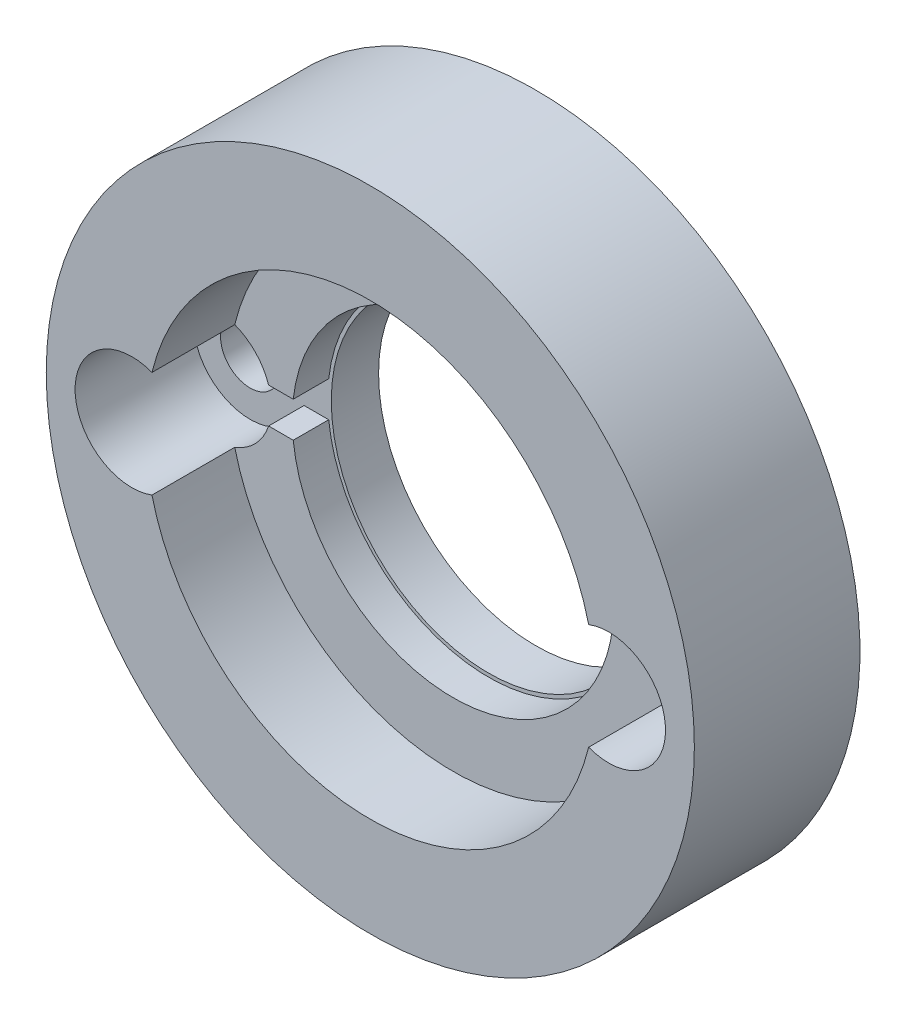
ISO-10303-21;
HEADER;
FILE_DESCRIPTION(('STEP AP214'),'2;1');
FILE_NAME('part.step','',(''),(''),'','','');
FILE_SCHEMA(('AUTOMOTIVE_DESIGN { 1 0 10303 214 1 1 1 1 }'));
ENDSEC;
DATA;
#1=APPLICATION_CONTEXT('core data for automotive mechanical design processes');
#2=APPLICATION_PROTOCOL_DEFINITION('international standard','automotive_design',2000,#1);
#3=PRODUCT_CONTEXT('',#1,'mechanical');
#4=PRODUCT('Part','Part','',(#3));
#5=PRODUCT_RELATED_PRODUCT_CATEGORY('part','',(#4));
#6=PRODUCT_DEFINITION_FORMATION('','',#4);
#7=PRODUCT_DEFINITION_CONTEXT('part definition',#1,'design');
#8=PRODUCT_DEFINITION('design','',#6,#7);
#9=PRODUCT_DEFINITION_SHAPE('','',#8);
#10=(LENGTH_UNIT() NAMED_UNIT(*) SI_UNIT(.MILLI.,.METRE.));
#11=(NAMED_UNIT(*) PLANE_ANGLE_UNIT() SI_UNIT($,.RADIAN.));
#12=(NAMED_UNIT(*) SI_UNIT($,.STERADIAN.) SOLID_ANGLE_UNIT());
#13=UNCERTAINTY_MEASURE_WITH_UNIT(LENGTH_MEASURE(1.E-05),#10,'distance_accuracy_value','');
#14=(GEOMETRIC_REPRESENTATION_CONTEXT(3) GLOBAL_UNCERTAINTY_ASSIGNED_CONTEXT((#13)) GLOBAL_UNIT_ASSIGNED_CONTEXT((#10,
#11,#12)) REPRESENTATION_CONTEXT('',''));
#15=CARTESIAN_POINT('',(0.,0.,0.));
#16=DIRECTION('',(0.,0.,1.));
#17=DIRECTION('',(1.,0.,0.));
#18=AXIS2_PLACEMENT_3D('',#15,#16,#17);
#19=CARTESIAN_POINT('',(0.,0.750000000000005,5.));
#20=DIRECTION('',(0.,-1.,0.));
#21=DIRECTION('',(1.,0.,0.));
#22=AXIS2_PLACEMENT_3D('',#19,#20,#21);
#23=PLANE('',#22);
#24=DIRECTION('',(0.,0.,1.));
#25=VECTOR('',#24,1.);
#26=CARTESIAN_POINT('',(6.75851315009448,0.750000000000008,-1.5));
#27=LINE('',#26,#25);
#28=CARTESIAN_POINT('',(6.75851315009448,0.750000000000008,0.));
#29=VERTEX_POINT('',#28);
#30=CARTESIAN_POINT('',(6.75851315009448,0.750000000000008,1.5));
#31=VERTEX_POINT('',#30);
#32=EDGE_CURVE('E65',#29,#31,#27,.T.);
#33=ORIENTED_EDGE('',*,*,#32,.F.);
#34=DIRECTION('',(-1.,0.,0.));
#35=VECTOR('',#34,1.);
#36=CARTESIAN_POINT('',(0.,0.750000000000005,0.));
#37=LINE('',#36,#35);
#38=CARTESIAN_POINT('',(7.80019737696441,0.750000000000009,0.));
#39=VERTEX_POINT('',#38);
#40=EDGE_CURVE('E137',#39,#29,#37,.T.);
#41=ORIENTED_EDGE('',*,*,#40,.F.);
#42=DIRECTION('',(0.,0.,-1.));
#43=VECTOR('',#42,1.);
#44=CARTESIAN_POINT('',(7.80019737696441,0.750000000000009,5.));
#45=LINE('',#44,#43);
#46=CARTESIAN_POINT('',(7.80019737696441,0.750000000000009,1.5));
#47=VERTEX_POINT('',#46);
#48=EDGE_CURVE('E147',#47,#39,#45,.T.);
#49=ORIENTED_EDGE('',*,*,#48,.F.);
#50=DIRECTION('',(-1.,0.,0.));
#51=VECTOR('',#50,1.);
#52=CARTESIAN_POINT('',(0.,0.750000000000005,1.5));
#53=LINE('',#52,#51);
#54=EDGE_CURVE('E229',#47,#31,#53,.T.);
#55=ORIENTED_EDGE('',*,*,#54,.T.);
#56=EDGE_LOOP('',(#33,#41,#49,#55));
#57=FACE_BOUND('',#56,.T.);
#58=ADVANCED_FACE('F40',(#57),#23,.T.);
#59=CARTESIAN_POINT('',(0.,-0.750000000000005,5.));
#60=DIRECTION('',(0.,-1.,0.));
#61=DIRECTION('',(1.,0.,0.));
#62=AXIS2_PLACEMENT_3D('',#59,#60,#61);
#63=PLANE('',#62);
#64=DIRECTION('',(-1.,0.,0.));
#65=VECTOR('',#64,1.);
#66=CARTESIAN_POINT('',(0.,-0.750000000000005,0.));
#67=LINE('',#66,#65);
#68=CARTESIAN_POINT('',(7.8001973769644,-0.750000000000004,0.));
#69=VERTEX_POINT('',#68);
#70=CARTESIAN_POINT('',(6.75851315009448,-0.750000000000004,0.));
#71=VERTEX_POINT('',#70);
#72=EDGE_CURVE('E139',#69,#71,#67,.T.);
#73=ORIENTED_EDGE('',*,*,#72,.T.);
#74=DIRECTION('',(0.,0.,1.));
#75=VECTOR('',#74,1.);
#76=CARTESIAN_POINT('',(6.75851315009448,-0.750000000000004,-1.5));
#77=LINE('',#76,#75);
#78=CARTESIAN_POINT('',(6.75851315009448,-0.750000000000004,1.5));
#79=VERTEX_POINT('',#78);
#80=EDGE_CURVE('E206',#71,#79,#77,.T.);
#81=ORIENTED_EDGE('',*,*,#80,.T.);
#82=DIRECTION('',(-1.,0.,0.));
#83=VECTOR('',#82,1.);
#84=CARTESIAN_POINT('',(0.,-0.750000000000005,1.5));
#85=LINE('',#84,#83);
#86=CARTESIAN_POINT('',(7.8001973769644,-0.750000000000004,1.5));
#87=VERTEX_POINT('',#86);
#88=EDGE_CURVE('E233',#87,#79,#85,.T.);
#89=ORIENTED_EDGE('',*,*,#88,.F.);
#90=DIRECTION('',(0.,0.,-1.));
#91=VECTOR('',#90,1.);
#92=CARTESIAN_POINT('',(7.8001973769644,-0.750000000000004,5.));
#93=LINE('',#92,#91);
#94=EDGE_CURVE('E155',#87,#69,#93,.T.);
#95=ORIENTED_EDGE('',*,*,#94,.T.);
#96=EDGE_LOOP('',(#73,#81,#89,#95));
#97=FACE_BOUND('',#96,.T.);
#98=ADVANCED_FACE('F276',(#97),#63,.F.);
#99=DIRECTION('',(0.,0.,1.));
#100=VECTOR('',#99,1.);
#101=CARTESIAN_POINT('',(-6.75851315009448,0.750000000000002,-1.5));
#102=LINE('',#101,#100);
#103=CARTESIAN_POINT('',(-6.75851315009448,0.750000000000002,1.5));
#104=VERTEX_POINT('',#103);
#105=CARTESIAN_POINT('',(-6.75851315009448,0.750000000000002,0.));
#106=VERTEX_POINT('',#105);
#107=EDGE_CURVE('E209',#104,#106,#102,.F.);
#108=ORIENTED_EDGE('',*,*,#107,.F.);
#109=CARTESIAN_POINT('',(-7.8001973769644,0.750000000000001,1.5));
#110=VERTEX_POINT('',#109);
#111=EDGE_CURVE('E228',#104,#110,#53,.T.);
#112=ORIENTED_EDGE('',*,*,#111,.T.);
#113=DIRECTION('',(0.,0.,-1.));
#114=VECTOR('',#113,1.);
#115=CARTESIAN_POINT('',(-7.8001973769644,0.750000000000001,5.));
#116=LINE('',#115,#114);
#117=CARTESIAN_POINT('',(-7.8001973769644,0.750000000000001,0.));
#118=VERTEX_POINT('',#117);
#119=EDGE_CURVE('E168',#110,#118,#116,.T.);
#120=ORIENTED_EDGE('',*,*,#119,.T.);
#121=EDGE_CURVE('E157',#106,#118,#37,.T.);
#122=ORIENTED_EDGE('',*,*,#121,.F.);
#123=EDGE_LOOP('',(#108,#112,#120,#122));
#124=FACE_BOUND('',#123,.T.);
#125=ADVANCED_FACE('F42',(#124),#23,.T.);
#126=CARTESIAN_POINT('',(-6.75851315009448,-0.750000000000006,1.5));
#127=VERTEX_POINT('',#126);
#128=CARTESIAN_POINT('',(-7.8001973769644,-0.750000000000006,1.5));
#129=VERTEX_POINT('',#128);
#130=EDGE_CURVE('E232',#127,#129,#85,.T.);
#131=ORIENTED_EDGE('',*,*,#130,.F.);
#132=DIRECTION('',(0.,0.,1.));
#133=VECTOR('',#132,1.);
#134=CARTESIAN_POINT('',(-6.75851315009448,-0.750000000000006,-1.5));
#135=LINE('',#134,#133);
#136=CARTESIAN_POINT('',(-6.75851315009448,-0.750000000000006,0.));
#137=VERTEX_POINT('',#136);
#138=EDGE_CURVE('E57',#127,#137,#135,.F.);
#139=ORIENTED_EDGE('',*,*,#138,.T.);
#140=CARTESIAN_POINT('',(-7.8001973769644,-0.750000000000006,0.));
#141=VERTEX_POINT('',#140);
#142=EDGE_CURVE('E143',#137,#141,#67,.T.);
#143=ORIENTED_EDGE('',*,*,#142,.T.);
#144=DIRECTION('',(0.,0.,-1.));
#145=VECTOR('',#144,1.);
#146=CARTESIAN_POINT('',(-7.8001973769644,-0.750000000000006,5.));
#147=LINE('',#146,#145);
#148=EDGE_CURVE('E171',#129,#141,#147,.T.);
#149=ORIENTED_EDGE('',*,*,#148,.F.);
#150=EDGE_LOOP('',(#131,#139,#143,#149));
#151=FACE_BOUND('',#150,.T.);
#152=ADVANCED_FACE('F283',(#151),#63,.F.);
#153=CARTESIAN_POINT('',(10.08,0.,5.));
#154=DIRECTION('',(0.,0.,-1.));
#155=DIRECTION('',(-1.,0.,0.));
#156=AXIS2_PLACEMENT_3D('',#153,#154,#155);
#157=CYLINDRICAL_SURFACE('',#156,2.4);
#158=CARTESIAN_POINT('',(10.08,0.,1.5));
#159=DIRECTION('',(0.,0.,1.));
#160=DIRECTION('',(1.,0.,0.));
#161=AXIS2_PLACEMENT_3D('',#158,#159,#160);
#162=CIRCLE('',#161,2.4);
#163=CARTESIAN_POINT('',(9.23097222222222,-2.24480552221383,1.5));
#164=VERTEX_POINT('',#163);
#165=EDGE_CURVE('E159',#164,#87,#162,.F.);
#166=ORIENTED_EDGE('',*,*,#165,.F.);
#167=DIRECTION('',(0.,0.,1.));
#168=VECTOR('',#167,1.);
#169=CARTESIAN_POINT('',(9.23097222222222,-2.24480552221383,3.25));
#170=LINE('',#169,#168);
#171=CARTESIAN_POINT('',(9.23097222222222,-2.24480552221383,5.));
#172=VERTEX_POINT('',#171);
#173=EDGE_CURVE('E223',#164,#172,#170,.T.);
#174=ORIENTED_EDGE('',*,*,#173,.T.);
#175=CARTESIAN_POINT('',(10.08,0.,5.));
#176=DIRECTION('',(0.,0.,1.));
#177=DIRECTION('',(1.,0.,0.));
#178=AXIS2_PLACEMENT_3D('',#175,#176,#177);
#179=CIRCLE('',#178,2.4);
#180=CARTESIAN_POINT('',(9.23097222222222,2.24480552221383,5.));
#181=VERTEX_POINT('',#180);
#182=EDGE_CURVE('E167',#181,#172,#179,.F.);
#183=ORIENTED_EDGE('',*,*,#182,.F.);
#184=DIRECTION('',(0.,0.,1.));
#185=VECTOR('',#184,1.);
#186=CARTESIAN_POINT('',(9.23097222222222,2.24480552221383,3.25));
#187=LINE('',#186,#185);
#188=CARTESIAN_POINT('',(9.23097222222222,2.24480552221384,1.5));
#189=VERTEX_POINT('',#188);
#190=EDGE_CURVE('E226',#181,#189,#187,.F.);
#191=ORIENTED_EDGE('',*,*,#190,.T.);
#192=EDGE_CURVE('E151',#47,#189,#162,.F.);
#193=ORIENTED_EDGE('',*,*,#192,.F.);
#194=ORIENTED_EDGE('',*,*,#48,.T.);
#195=CARTESIAN_POINT('',(10.08,0.,0.));
#196=DIRECTION('',(0.,0.,1.));
#197=DIRECTION('',(1.,0.,0.));
#198=AXIS2_PLACEMENT_3D('',#195,#196,#197);
#199=CIRCLE('',#198,2.4);
#200=EDGE_CURVE('E132',#39,#69,#199,.F.);
#201=ORIENTED_EDGE('',*,*,#200,.T.);
#202=ORIENTED_EDGE('',*,*,#94,.F.);
#203=EDGE_LOOP('',(#166,#174,#183,#191,#193,#194,#201,#202));
#204=FACE_BOUND('',#203,.T.);
#205=ADVANCED_FACE('F149',(#204),#157,.F.);
#206=CARTESIAN_POINT('',(-10.08,0.,5.));
#207=DIRECTION('',(0.,0.,-1.));
#208=DIRECTION('',(-1.,0.,0.));
#209=AXIS2_PLACEMENT_3D('',#206,#207,#208);
#210=CYLINDRICAL_SURFACE('',#209,2.4);
#211=DIRECTION('',(0.,0.,1.));
#212=VECTOR('',#211,1.);
#213=CARTESIAN_POINT('',(-9.23097222222222,-2.24480552221383,3.25));
#214=LINE('',#213,#212);
#215=CARTESIAN_POINT('',(-9.23097222222222,-2.24480552221384,1.5));
#216=VERTEX_POINT('',#215);
#217=CARTESIAN_POINT('',(-9.23097222222222,-2.24480552221383,5.));
#218=VERTEX_POINT('',#217);
#219=EDGE_CURVE('E221',#216,#218,#214,.T.);
#220=ORIENTED_EDGE('',*,*,#219,.F.);
#221=CARTESIAN_POINT('',(-10.08,0.,1.5));
#222=DIRECTION('',(0.,0.,1.));
#223=DIRECTION('',(1.,0.,0.));
#224=AXIS2_PLACEMENT_3D('',#221,#222,#223);
#225=CIRCLE('',#224,2.4);
#226=EDGE_CURVE('E11',#216,#129,#225,.T.);
#227=ORIENTED_EDGE('',*,*,#226,.T.);
#228=ORIENTED_EDGE('',*,*,#148,.T.);
#229=CARTESIAN_POINT('',(-10.08,0.,0.));
#230=DIRECTION('',(0.,0.,1.));
#231=DIRECTION('',(1.,0.,0.));
#232=AXIS2_PLACEMENT_3D('',#229,#230,#231);
#233=CIRCLE('',#232,2.4);
#234=EDGE_CURVE('E165',#118,#141,#233,.T.);
#235=ORIENTED_EDGE('',*,*,#234,.F.);
#236=ORIENTED_EDGE('',*,*,#119,.F.);
#237=CARTESIAN_POINT('',(-9.23097222222222,2.24480552221383,1.5));
#238=VERTEX_POINT('',#237);
#239=EDGE_CURVE('E49',#110,#238,#225,.T.);
#240=ORIENTED_EDGE('',*,*,#239,.T.);
#241=DIRECTION('',(0.,0.,1.));
#242=VECTOR('',#241,1.);
#243=CARTESIAN_POINT('',(-9.23097222222222,2.24480552221383,3.25));
#244=LINE('',#243,#242);
#245=CARTESIAN_POINT('',(-9.23097222222222,2.24480552221383,5.));
#246=VERTEX_POINT('',#245);
#247=EDGE_CURVE('E217',#246,#238,#244,.F.);
#248=ORIENTED_EDGE('',*,*,#247,.F.);
#249=CARTESIAN_POINT('',(-10.08,0.,5.));
#250=DIRECTION('',(0.,0.,1.));
#251=DIRECTION('',(1.,0.,0.));
#252=AXIS2_PLACEMENT_3D('',#249,#250,#251);
#253=CIRCLE('',#252,2.4);
#254=EDGE_CURVE('E237',#246,#218,#253,.T.);
#255=ORIENTED_EDGE('',*,*,#254,.T.);
#256=EDGE_LOOP('',(#220,#227,#228,#235,#236,#240,#248,#255));
#257=FACE_BOUND('',#256,.T.);
#258=ADVANCED_FACE('F251',(#257),#210,.F.);
#259=CARTESIAN_POINT('',(0.,0.,5.));
#260=DIRECTION('',(0.,0.,-1.));
#261=DIRECTION('',(-1.,0.,0.));
#262=AXIS2_PLACEMENT_3D('',#259,#260,#261);
#263=CYLINDRICAL_SURFACE('',#262,13.7);
#264=CARTESIAN_POINT('',(0.,0.,5.));
#265=DIRECTION('',(0.,0.,1.));
#266=DIRECTION('',(1.,0.,0.));
#267=AXIS2_PLACEMENT_3D('',#264,#265,#266);
#268=CIRCLE('',#267,13.7);
#269=CARTESIAN_POINT('',(13.7,0.,5.));
#270=VERTEX_POINT('',#269);
#271=EDGE_CURVE('E161',#270,#270,#268,.T.);
#272=ORIENTED_EDGE('',*,*,#271,.F.);
#273=EDGE_LOOP('',(#272));
#274=FACE_BOUND('',#273,.T.);
#275=CARTESIAN_POINT('',(0.,0.,-2.));
#276=DIRECTION('',(0.,0.,-1.));
#277=DIRECTION('',(-1.,0.,0.));
#278=AXIS2_PLACEMENT_3D('',#275,#276,#277);
#279=CIRCLE('',#278,13.7);
#280=CARTESIAN_POINT('',(-13.7,0.,-2.));
#281=VERTEX_POINT('',#280);
#282=EDGE_CURVE('E194',#281,#281,#279,.T.);
#283=ORIENTED_EDGE('',*,*,#282,.F.);
#284=EDGE_LOOP('',(#283));
#285=FACE_BOUND('',#284,.T.);
#286=ADVANCED_FACE('F248',(#274,#285),#263,.T.);
#287=CARTESIAN_POINT('',(0.,0.,5.));
#288=DIRECTION('',(0.,0.,1.));
#289=DIRECTION('',(1.,0.,0.));
#290=AXIS2_PLACEMENT_3D('',#287,#288,#289);
#291=PLANE('',#290);
#292=CARTESIAN_POINT('',(0.,0.,5.));
#293=DIRECTION('',(0.,0.,1.));
#294=DIRECTION('',(1.,0.,0.));
#295=AXIS2_PLACEMENT_3D('',#292,#293,#294);
#296=CIRCLE('',#295,9.5);
#297=EDGE_CURVE('E213',#181,#246,#296,.T.);
#298=ORIENTED_EDGE('',*,*,#297,.F.);
#299=ORIENTED_EDGE('',*,*,#182,.T.);
#300=CARTESIAN_POINT('',(0.,0.,5.));
#301=DIRECTION('',(0.,0.,1.));
#302=DIRECTION('',(1.,0.,0.));
#303=AXIS2_PLACEMENT_3D('',#300,#301,#302);
#304=CIRCLE('',#303,9.5);
#305=EDGE_CURVE('E154',#218,#172,#304,.T.);
#306=ORIENTED_EDGE('',*,*,#305,.F.);
#307=ORIENTED_EDGE('',*,*,#254,.F.);
#308=EDGE_LOOP('',(#298,#299,#306,#307));
#309=FACE_BOUND('',#308,.T.);
#310=ORIENTED_EDGE('',*,*,#271,.T.);
#311=EDGE_LOOP('',(#310));
#312=FACE_BOUND('',#311,.T.);
#313=ADVANCED_FACE('F246',(#309,#312),#291,.T.);
#314=CARTESIAN_POINT('',(0.,0.,1.5));
#315=DIRECTION('',(0.,0.,1.));
#316=DIRECTION('',(1.,0.,0.));
#317=AXIS2_PLACEMENT_3D('',#314,#315,#316);
#318=CYLINDRICAL_SURFACE('',#317,9.5);
#319=CARTESIAN_POINT('',(0.,0.,1.5));
#320=DIRECTION('',(0.,0.,1.));
#321=DIRECTION('',(1.,0.,0.));
#322=AXIS2_PLACEMENT_3D('',#319,#320,#321);
#323=CIRCLE('',#322,9.5);
#324=EDGE_CURVE('E218',#216,#164,#323,.T.);
#325=ORIENTED_EDGE('',*,*,#324,.F.);
#326=ORIENTED_EDGE('',*,*,#219,.T.);
#327=ORIENTED_EDGE('',*,*,#305,.T.);
#328=ORIENTED_EDGE('',*,*,#173,.F.);
#329=EDGE_LOOP('',(#325,#326,#327,#328));
#330=FACE_BOUND('',#329,.T.);
#331=ADVANCED_FACE('F308',(#330),#318,.F.);
#332=CARTESIAN_POINT('',(0.,0.,1.5));
#333=DIRECTION('',(0.,0.,1.));
#334=DIRECTION('',(1.,0.,0.));
#335=AXIS2_PLACEMENT_3D('',#332,#333,#334);
#336=PLANE('',#335);
#337=CARTESIAN_POINT('',(0.,0.,1.5));
#338=DIRECTION('',(0.,0.,1.));
#339=DIRECTION('',(1.,0.,0.));
#340=AXIS2_PLACEMENT_3D('',#337,#338,#339);
#341=CIRCLE('',#340,6.8);
#342=EDGE_CURVE('E199',#127,#79,#341,.T.);
#343=ORIENTED_EDGE('',*,*,#342,.F.);
#344=ORIENTED_EDGE('',*,*,#130,.T.);
#345=ORIENTED_EDGE('',*,*,#226,.F.);
#346=ORIENTED_EDGE('',*,*,#324,.T.);
#347=ORIENTED_EDGE('',*,*,#165,.T.);
#348=ORIENTED_EDGE('',*,*,#88,.T.);
#349=EDGE_LOOP('',(#343,#344,#345,#346,#347,#348));
#350=FACE_BOUND('',#349,.T.);
#351=ADVANCED_FACE('F303',(#350),#336,.T.);
#352=EDGE_CURVE('E200',#31,#104,#341,.T.);
#353=ORIENTED_EDGE('',*,*,#352,.F.);
#354=ORIENTED_EDGE('',*,*,#54,.F.);
#355=ORIENTED_EDGE('',*,*,#192,.T.);
#356=EDGE_CURVE('E214',#189,#238,#323,.T.);
#357=ORIENTED_EDGE('',*,*,#356,.T.);
#358=ORIENTED_EDGE('',*,*,#239,.F.);
#359=ORIENTED_EDGE('',*,*,#111,.F.);
#360=EDGE_LOOP('',(#353,#354,#355,#357,#358,#359));
#361=FACE_BOUND('',#360,.T.);
#362=ADVANCED_FACE('F295',(#361),#336,.T.);
#363=ORIENTED_EDGE('',*,*,#297,.T.);
#364=ORIENTED_EDGE('',*,*,#247,.T.);
#365=ORIENTED_EDGE('',*,*,#356,.F.);
#366=ORIENTED_EDGE('',*,*,#190,.F.);
#367=EDGE_LOOP('',(#363,#364,#365,#366));
#368=FACE_BOUND('',#367,.T.);
#369=ADVANCED_FACE('F320',(#368),#318,.F.);
#370=CARTESIAN_POINT('',(0.,0.,-1.5));
#371=DIRECTION('',(0.,0.,1.));
#372=DIRECTION('',(1.,0.,0.));
#373=AXIS2_PLACEMENT_3D('',#370,#371,#372);
#374=CYLINDRICAL_SURFACE('',#373,6.8);
#375=ORIENTED_EDGE('',*,*,#32,.T.);
#376=ORIENTED_EDGE('',*,*,#352,.T.);
#377=ORIENTED_EDGE('',*,*,#107,.T.);
#378=CARTESIAN_POINT('',(0.,0.,0.));
#379=DIRECTION('',(0.,0.,1.));
#380=DIRECTION('',(1.,0.,0.));
#381=AXIS2_PLACEMENT_3D('',#378,#379,#380);
#382=CIRCLE('',#381,6.8);
#383=EDGE_CURVE('E204',#29,#106,#382,.T.);
#384=ORIENTED_EDGE('',*,*,#383,.F.);
#385=EDGE_LOOP('',(#375,#376,#377,#384));
#386=FACE_BOUND('',#385,.T.);
#387=ADVANCED_FACE('F315',(#386),#374,.F.);
#388=EDGE_CURVE('E202',#137,#71,#382,.T.);
#389=ORIENTED_EDGE('',*,*,#388,.F.);
#390=ORIENTED_EDGE('',*,*,#138,.F.);
#391=ORIENTED_EDGE('',*,*,#342,.T.);
#392=ORIENTED_EDGE('',*,*,#80,.F.);
#393=EDGE_LOOP('',(#389,#390,#391,#392));
#394=FACE_BOUND('',#393,.T.);
#395=ADVANCED_FACE('F258',(#394),#374,.F.);
#396=CARTESIAN_POINT('',(0.,0.,-2.));
#397=DIRECTION('',(0.,0.,-1.));
#398=DIRECTION('',(-1.,0.,0.));
#399=AXIS2_PLACEMENT_3D('',#396,#397,#398);
#400=PLANE('',#399);
#401=CARTESIAN_POINT('',(-10.08,0.,-2.));
#402=DIRECTION('',(0.,0.,1.));
#403=DIRECTION('',(1.,0.,0.));
#404=AXIS2_PLACEMENT_3D('',#401,#402,#403);
#405=CIRCLE('',#404,1.25);
#406=CARTESIAN_POINT('',(-8.83,0.,-2.));
#407=VERTEX_POINT('',#406);
#408=EDGE_CURVE('E178',#407,#407,#405,.T.);
#409=ORIENTED_EDGE('',*,*,#408,.T.);
#410=EDGE_LOOP('',(#409));
#411=FACE_BOUND('',#410,.T.);
#412=CARTESIAN_POINT('',(10.08,0.,-2.));
#413=DIRECTION('',(0.,0.,1.));
#414=DIRECTION('',(1.,0.,0.));
#415=AXIS2_PLACEMENT_3D('',#412,#413,#414);
#416=CIRCLE('',#415,1.25);
#417=CARTESIAN_POINT('',(11.33,0.,-2.));
#418=VERTEX_POINT('',#417);
#419=EDGE_CURVE('E184',#418,#418,#416,.T.);
#420=ORIENTED_EDGE('',*,*,#419,.T.);
#421=EDGE_LOOP('',(#420));
#422=FACE_BOUND('',#421,.T.);
#423=ORIENTED_EDGE('',*,*,#282,.T.);
#424=EDGE_LOOP('',(#423));
#425=FACE_BOUND('',#424,.T.);
#426=CARTESIAN_POINT('',(0.,0.,-2.));
#427=DIRECTION('',(0.,0.,-1.));
#428=DIRECTION('',(-1.,0.,0.));
#429=AXIS2_PLACEMENT_3D('',#426,#427,#428);
#430=CIRCLE('',#429,6.65);
#431=CARTESIAN_POINT('',(-6.65,0.,-2.));
#432=VERTEX_POINT('',#431);
#433=EDGE_CURVE('E191',#432,#432,#430,.T.);
#434=ORIENTED_EDGE('',*,*,#433,.F.);
#435=EDGE_LOOP('',(#434));
#436=FACE_BOUND('',#435,.T.);
#437=ADVANCED_FACE('F255',(#411,#422,#425,#436),#400,.T.);
#438=CARTESIAN_POINT('',(0.,0.,0.));
#439=DIRECTION('',(0.,0.,-1.));
#440=DIRECTION('',(-1.,0.,0.));
#441=AXIS2_PLACEMENT_3D('',#438,#439,#440);
#442=PLANE('',#441);
#443=CARTESIAN_POINT('',(-10.08,0.,0.));
#444=DIRECTION('',(0.,0.,-1.));
#445=DIRECTION('',(-1.,0.,0.));
#446=AXIS2_PLACEMENT_3D('',#443,#444,#445);
#447=CIRCLE('',#446,1.25);
#448=CARTESIAN_POINT('',(-11.33,0.,0.));
#449=VERTEX_POINT('',#448);
#450=EDGE_CURVE('E44',#449,#449,#447,.T.);
#451=ORIENTED_EDGE('',*,*,#450,.T.);
#452=EDGE_LOOP('',(#451));
#453=FACE_BOUND('',#452,.T.);
#454=CARTESIAN_POINT('',(10.08,0.,0.));
#455=DIRECTION('',(0.,0.,-1.));
#456=DIRECTION('',(-1.,0.,0.));
#457=AXIS2_PLACEMENT_3D('',#454,#455,#456);
#458=CIRCLE('',#457,1.25);
#459=CARTESIAN_POINT('',(8.83,0.,0.));
#460=VERTEX_POINT('',#459);
#461=EDGE_CURVE('E176',#460,#460,#458,.T.);
#462=ORIENTED_EDGE('',*,*,#461,.T.);
#463=EDGE_LOOP('',(#462));
#464=FACE_BOUND('',#463,.T.);
#465=ORIENTED_EDGE('',*,*,#200,.F.);
#466=ORIENTED_EDGE('',*,*,#40,.T.);
#467=ORIENTED_EDGE('',*,*,#383,.T.);
#468=ORIENTED_EDGE('',*,*,#121,.T.);
#469=ORIENTED_EDGE('',*,*,#234,.T.);
#470=ORIENTED_EDGE('',*,*,#142,.F.);
#471=ORIENTED_EDGE('',*,*,#388,.T.);
#472=ORIENTED_EDGE('',*,*,#72,.F.);
#473=EDGE_LOOP('',(#465,#466,#467,#468,#469,#470,#471,#472));
#474=FACE_BOUND('',#473,.T.);
#475=CARTESIAN_POINT('',(0.,0.,0.));
#476=DIRECTION('',(0.,0.,-1.));
#477=DIRECTION('',(-1.,0.,0.));
#478=AXIS2_PLACEMENT_3D('',#475,#476,#477);
#479=CIRCLE('',#478,6.65);
#480=CARTESIAN_POINT('',(-6.65,0.,0.));
#481=VERTEX_POINT('',#480);
#482=EDGE_CURVE('E182',#481,#481,#479,.T.);
#483=ORIENTED_EDGE('',*,*,#482,.T.);
#484=EDGE_LOOP('',(#483));
#485=FACE_BOUND('',#484,.T.);
#486=ADVANCED_FACE('F134',(#453,#464,#474,#485),#442,.F.);
#487=CARTESIAN_POINT('',(0.,0.,-2.));
#488=DIRECTION('',(0.,0.,1.));
#489=DIRECTION('',(1.,0.,0.));
#490=AXIS2_PLACEMENT_3D('',#487,#488,#489);
#491=CYLINDRICAL_SURFACE('',#490,6.65);
#492=ORIENTED_EDGE('',*,*,#433,.T.);
#493=EDGE_LOOP('',(#492));
#494=FACE_BOUND('',#493,.T.);
#495=ORIENTED_EDGE('',*,*,#482,.F.);
#496=EDGE_LOOP('',(#495));
#497=FACE_BOUND('',#496,.T.);
#498=ADVANCED_FACE('F262',(#494,#497),#491,.F.);
#499=CARTESIAN_POINT('',(10.08,0.,-2.));
#500=DIRECTION('',(0.,0.,1.));
#501=DIRECTION('',(1.,0.,0.));
#502=AXIS2_PLACEMENT_3D('',#499,#500,#501);
#503=CYLINDRICAL_SURFACE('',#502,1.25);
#504=ORIENTED_EDGE('',*,*,#419,.F.);
#505=EDGE_LOOP('',(#504));
#506=FACE_BOUND('',#505,.T.);
#507=ORIENTED_EDGE('',*,*,#461,.F.);
#508=EDGE_LOOP('',(#507));
#509=FACE_BOUND('',#508,.T.);
#510=ADVANCED_FACE('F265',(#506,#509),#503,.F.);
#511=CARTESIAN_POINT('',(-10.08,0.,-2.));
#512=DIRECTION('',(0.,0.,1.));
#513=DIRECTION('',(1.,0.,0.));
#514=AXIS2_PLACEMENT_3D('',#511,#512,#513);
#515=CYLINDRICAL_SURFACE('',#514,1.25);
#516=ORIENTED_EDGE('',*,*,#408,.F.);
#517=EDGE_LOOP('',(#516));
#518=FACE_BOUND('',#517,.T.);
#519=ORIENTED_EDGE('',*,*,#450,.F.);
#520=EDGE_LOOP('',(#519));
#521=FACE_BOUND('',#520,.T.);
#522=ADVANCED_FACE('F429',(#518,#521),#515,.F.);
#523=CLOSED_SHELL('',(#58,#98,#125,#152,#205,#258,#286,#313,#331,#351,#362,#369,#387,#395,#437,
#486,#498,#510,#522));
#524=MANIFOLD_SOLID_BREP('B2',#523);
#525=ADVANCED_BREP_SHAPE_REPRESENTATION('',(#18,#524),#14);
#526=SHAPE_DEFINITION_REPRESENTATION(#9,#525);
ENDSEC;
END-ISO-10303-21;
